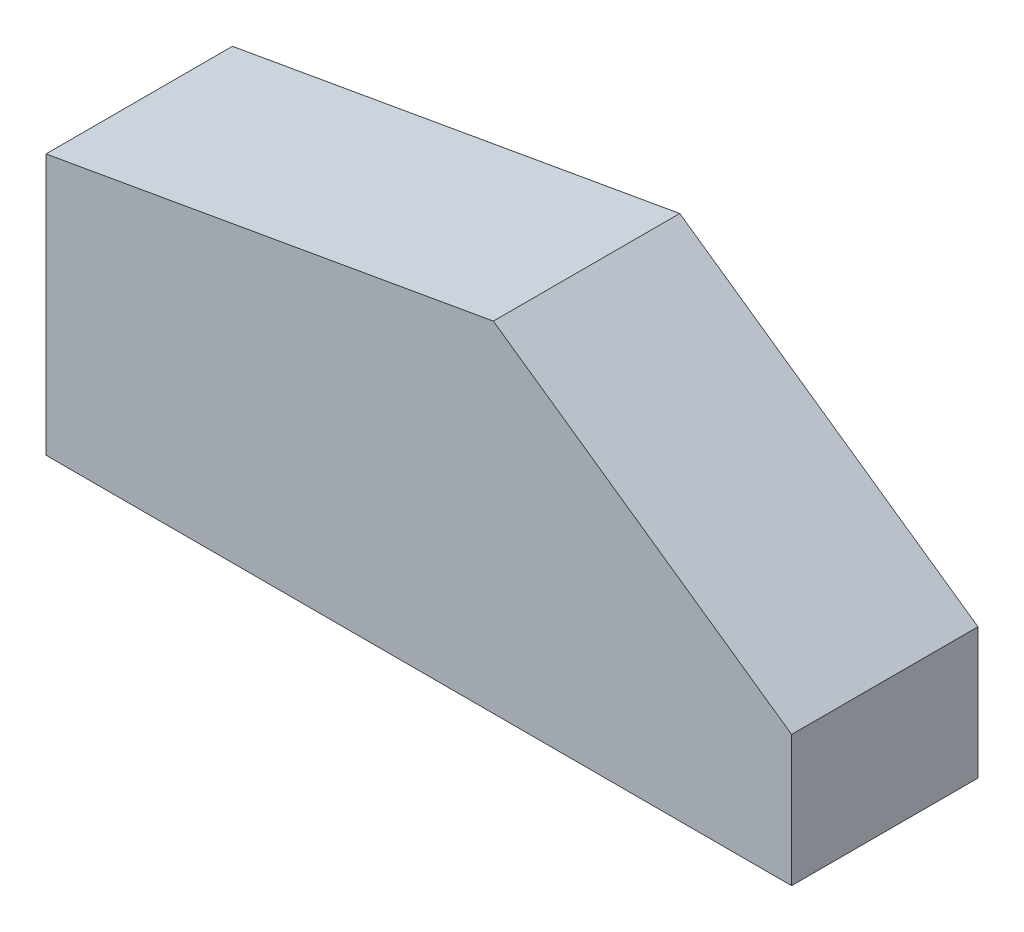
ISO-10303-21;
HEADER;
FILE_DESCRIPTION(('STEP AP214'),'2;1');
FILE_NAME('part.step','',(''),(''),'','','');
FILE_SCHEMA(('AUTOMOTIVE_DESIGN { 1 0 10303 214 1 1 1 1 }'));
ENDSEC;
DATA;
#1=APPLICATION_CONTEXT('core data for automotive mechanical design processes');
#2=APPLICATION_PROTOCOL_DEFINITION('international standard','automotive_design',2000,#1);
#3=PRODUCT_CONTEXT('',#1,'mechanical');
#4=PRODUCT('Part','Part','',(#3));
#5=PRODUCT_RELATED_PRODUCT_CATEGORY('part','',(#4));
#6=PRODUCT_DEFINITION_FORMATION('','',#4);
#7=PRODUCT_DEFINITION_CONTEXT('part definition',#1,'design');
#8=PRODUCT_DEFINITION('design','',#6,#7);
#9=PRODUCT_DEFINITION_SHAPE('','',#8);
#10=(LENGTH_UNIT() NAMED_UNIT(*) SI_UNIT(.MILLI.,.METRE.));
#11=(NAMED_UNIT(*) PLANE_ANGLE_UNIT() SI_UNIT($,.RADIAN.));
#12=(NAMED_UNIT(*) SI_UNIT($,.STERADIAN.) SOLID_ANGLE_UNIT());
#13=UNCERTAINTY_MEASURE_WITH_UNIT(LENGTH_MEASURE(1.E-05),#10,'distance_accuracy_value','');
#14=(GEOMETRIC_REPRESENTATION_CONTEXT(3) GLOBAL_UNCERTAINTY_ASSIGNED_CONTEXT((#13)) GLOBAL_UNIT_ASSIGNED_CONTEXT((#10,
#11,#12)) REPRESENTATION_CONTEXT('',''));
#15=CARTESIAN_POINT('',(0.,0.,0.));
#16=DIRECTION('',(0.,0.,1.));
#17=DIRECTION('',(1.,0.,0.));
#18=AXIS2_PLACEMENT_3D('',#15,#16,#17);
#19=CARTESIAN_POINT('',(0.,0.,25.));
#20=DIRECTION('',(1.,0.,0.));
#21=DIRECTION('',(0.,0.,-1.));
#22=AXIS2_PLACEMENT_3D('',#19,#20,#21);
#23=PLANE('',#22);
#24=DIRECTION('',(0.,-1.,0.));
#25=VECTOR('',#24,1.);
#26=CARTESIAN_POINT('',(0.,0.,0.));
#27=LINE('',#26,#25);
#28=CARTESIAN_POINT('',(0.,35.,0.));
#29=VERTEX_POINT('',#28);
#30=CARTESIAN_POINT('',(0.,0.,0.));
#31=VERTEX_POINT('',#30);
#32=EDGE_CURVE('E106',#29,#31,#27,.T.);
#33=ORIENTED_EDGE('',*,*,#32,.T.);
#34=DIRECTION('',(0.,0.,-1.));
#35=VECTOR('',#34,1.);
#36=CARTESIAN_POINT('',(0.,0.,25.));
#37=LINE('',#36,#35);
#38=CARTESIAN_POINT('',(0.,0.,25.));
#39=VERTEX_POINT('',#38);
#40=EDGE_CURVE('E11',#39,#31,#37,.T.);
#41=ORIENTED_EDGE('',*,*,#40,.F.);
#42=DIRECTION('',(0.,-1.,0.));
#43=VECTOR('',#42,1.);
#44=CARTESIAN_POINT('',(0.,0.,25.));
#45=LINE('',#44,#43);
#46=CARTESIAN_POINT('',(0.,35.,25.));
#47=VERTEX_POINT('',#46);
#48=EDGE_CURVE('E114',#47,#39,#45,.T.);
#49=ORIENTED_EDGE('',*,*,#48,.F.);
#50=DIRECTION('',(0.,0.,-1.));
#51=VECTOR('',#50,1.);
#52=CARTESIAN_POINT('',(0.,35.,25.));
#53=LINE('',#52,#51);
#54=EDGE_CURVE('E102',#47,#29,#53,.T.);
#55=ORIENTED_EDGE('',*,*,#54,.T.);
#56=EDGE_LOOP('',(#33,#41,#49,#55));
#57=FACE_BOUND('',#56,.T.);
#58=ADVANCED_FACE('F32',(#57),#23,.F.);
#59=CARTESIAN_POINT('',(0.,0.,25.));
#60=DIRECTION('',(0.,1.,0.));
#61=DIRECTION('',(0.,0.,1.));
#62=AXIS2_PLACEMENT_3D('',#59,#60,#61);
#63=PLANE('',#62);
#64=DIRECTION('',(1.,0.,0.));
#65=VECTOR('',#64,1.);
#66=CARTESIAN_POINT('',(0.,0.,0.));
#67=LINE('',#66,#65);
#68=CARTESIAN_POINT('',(100.,0.,0.));
#69=VERTEX_POINT('',#68);
#70=EDGE_CURVE('E109',#31,#69,#67,.T.);
#71=ORIENTED_EDGE('',*,*,#70,.T.);
#72=DIRECTION('',(0.,0.,-1.));
#73=VECTOR('',#72,1.);
#74=CARTESIAN_POINT('',(100.,0.,25.));
#75=LINE('',#74,#73);
#76=CARTESIAN_POINT('',(100.,0.,25.));
#77=VERTEX_POINT('',#76);
#78=EDGE_CURVE('E40',#77,#69,#75,.T.);
#79=ORIENTED_EDGE('',*,*,#78,.F.);
#80=DIRECTION('',(1.,0.,0.));
#81=VECTOR('',#80,1.);
#82=CARTESIAN_POINT('',(0.,0.,25.));
#83=LINE('',#82,#81);
#84=EDGE_CURVE('E82',#39,#77,#83,.T.);
#85=ORIENTED_EDGE('',*,*,#84,.F.);
#86=ORIENTED_EDGE('',*,*,#40,.T.);
#87=EDGE_LOOP('',(#71,#79,#85,#86));
#88=FACE_BOUND('',#87,.T.);
#89=ADVANCED_FACE('F133',(#88),#63,.F.);
#90=CARTESIAN_POINT('',(100.,0.,25.));
#91=DIRECTION('',(-1.,0.,0.));
#92=DIRECTION('',(0.,0.,1.));
#93=AXIS2_PLACEMENT_3D('',#90,#91,#92);
#94=PLANE('',#93);
#95=DIRECTION('',(0.,1.,0.));
#96=VECTOR('',#95,1.);
#97=CARTESIAN_POINT('',(100.,0.,0.));
#98=LINE('',#97,#96);
#99=CARTESIAN_POINT('',(100.,17.571317314119,0.));
#100=VERTEX_POINT('',#99);
#101=EDGE_CURVE('E97',#69,#100,#98,.T.);
#102=ORIENTED_EDGE('',*,*,#101,.T.);
#103=DIRECTION('',(0.,0.,-1.));
#104=VECTOR('',#103,1.);
#105=CARTESIAN_POINT('',(100.,17.571317314119,25.));
#106=LINE('',#105,#104);
#107=CARTESIAN_POINT('',(100.,17.571317314119,25.));
#108=VERTEX_POINT('',#107);
#109=EDGE_CURVE('E94',#108,#100,#106,.T.);
#110=ORIENTED_EDGE('',*,*,#109,.F.);
#111=DIRECTION('',(0.,1.,0.));
#112=VECTOR('',#111,1.);
#113=CARTESIAN_POINT('',(100.,0.,25.));
#114=LINE('',#113,#112);
#115=EDGE_CURVE('E86',#77,#108,#114,.T.);
#116=ORIENTED_EDGE('',*,*,#115,.F.);
#117=ORIENTED_EDGE('',*,*,#78,.T.);
#118=EDGE_LOOP('',(#102,#110,#116,#117));
#119=FACE_BOUND('',#118,.T.);
#120=ADVANCED_FACE('F95',(#119),#94,.F.);
#121=CARTESIAN_POINT('',(60.,45.5796188425077,25.));
#122=DIRECTION('',(-0.57357643635105,-0.819152044288989,0.));
#123=DIRECTION('',(0.819152044288989,-0.57357643635105,0.));
#124=AXIS2_PLACEMENT_3D('',#121,#122,#123);
#125=PLANE('',#124);
#126=DIRECTION('',(-0.819152044288989,0.57357643635105,0.));
#127=VECTOR('',#126,1.);
#128=CARTESIAN_POINT('',(60.,45.5796188425077,0.));
#129=LINE('',#128,#127);
#130=CARTESIAN_POINT('',(60.,45.5796188425077,0.));
#131=VERTEX_POINT('',#130);
#132=EDGE_CURVE('E68',#100,#131,#129,.T.);
#133=ORIENTED_EDGE('',*,*,#132,.T.);
#134=DIRECTION('',(0.,0.,-1.));
#135=VECTOR('',#134,1.);
#136=CARTESIAN_POINT('',(60.,45.5796188425077,25.));
#137=LINE('',#136,#135);
#138=CARTESIAN_POINT('',(60.,45.5796188425077,25.));
#139=VERTEX_POINT('',#138);
#140=EDGE_CURVE('E98',#139,#131,#137,.T.);
#141=ORIENTED_EDGE('',*,*,#140,.F.);
#142=DIRECTION('',(-0.819152044288989,0.57357643635105,0.));
#143=VECTOR('',#142,1.);
#144=CARTESIAN_POINT('',(60.,45.5796188425077,25.));
#145=LINE('',#144,#143);
#146=EDGE_CURVE('E90',#108,#139,#145,.T.);
#147=ORIENTED_EDGE('',*,*,#146,.F.);
#148=ORIENTED_EDGE('',*,*,#109,.T.);
#149=EDGE_LOOP('',(#133,#141,#147,#148));
#150=FACE_BOUND('',#149,.T.);
#151=ADVANCED_FACE('F100',(#150),#125,.F.);
#152=CARTESIAN_POINT('',(0.,35.,25.));
#153=DIRECTION('',(0.173648177666927,-0.984807753012209,0.));
#154=DIRECTION('',(0.984807753012209,0.173648177666927,0.));
#155=AXIS2_PLACEMENT_3D('',#152,#153,#154);
#156=PLANE('',#155);
#157=DIRECTION('',(-0.984807753012209,-0.173648177666927,0.));
#158=VECTOR('',#157,1.);
#159=CARTESIAN_POINT('',(0.,35.,0.));
#160=LINE('',#159,#158);
#161=EDGE_CURVE('E74',#131,#29,#160,.T.);
#162=ORIENTED_EDGE('',*,*,#161,.T.);
#163=ORIENTED_EDGE('',*,*,#54,.F.);
#164=DIRECTION('',(-0.984807753012209,-0.173648177666927,0.));
#165=VECTOR('',#164,1.);
#166=CARTESIAN_POINT('',(0.,35.,25.));
#167=LINE('',#166,#165);
#168=EDGE_CURVE('E48',#139,#47,#167,.T.);
#169=ORIENTED_EDGE('',*,*,#168,.F.);
#170=ORIENTED_EDGE('',*,*,#140,.T.);
#171=EDGE_LOOP('',(#162,#163,#169,#170));
#172=FACE_BOUND('',#171,.T.);
#173=ADVANCED_FACE('F122',(#172),#156,.F.);
#174=CARTESIAN_POINT('',(0.,0.,25.));
#175=DIRECTION('',(0.,0.,-1.));
#176=DIRECTION('',(-1.,0.,0.));
#177=AXIS2_PLACEMENT_3D('',#174,#175,#176);
#178=PLANE('',#177);
#179=ORIENTED_EDGE('',*,*,#48,.T.);
#180=ORIENTED_EDGE('',*,*,#84,.T.);
#181=ORIENTED_EDGE('',*,*,#115,.T.);
#182=ORIENTED_EDGE('',*,*,#146,.T.);
#183=ORIENTED_EDGE('',*,*,#168,.T.);
#184=EDGE_LOOP('',(#179,#180,#181,#182,#183));
#185=FACE_BOUND('',#184,.T.);
#186=ADVANCED_FACE('F88',(#185),#178,.F.);
#187=CARTESIAN_POINT('',(0.,0.,0.));
#188=DIRECTION('',(0.,0.,-1.));
#189=DIRECTION('',(-1.,0.,0.));
#190=AXIS2_PLACEMENT_3D('',#187,#188,#189);
#191=PLANE('',#190);
#192=ORIENTED_EDGE('',*,*,#32,.F.);
#193=ORIENTED_EDGE('',*,*,#161,.F.);
#194=ORIENTED_EDGE('',*,*,#132,.F.);
#195=ORIENTED_EDGE('',*,*,#101,.F.);
#196=ORIENTED_EDGE('',*,*,#70,.F.);
#197=EDGE_LOOP('',(#192,#193,#194,#195,#196));
#198=FACE_BOUND('',#197,.T.);
#199=ADVANCED_FACE('F118',(#198),#191,.T.);
#200=CLOSED_SHELL('',(#58,#89,#120,#151,#173,#186,#199));
#201=MANIFOLD_SOLID_BREP('B2',#200);
#202=ADVANCED_BREP_SHAPE_REPRESENTATION('',(#18,#201),#14);
#203=SHAPE_DEFINITION_REPRESENTATION(#9,#202);
ENDSEC;
END-ISO-10303-21;
